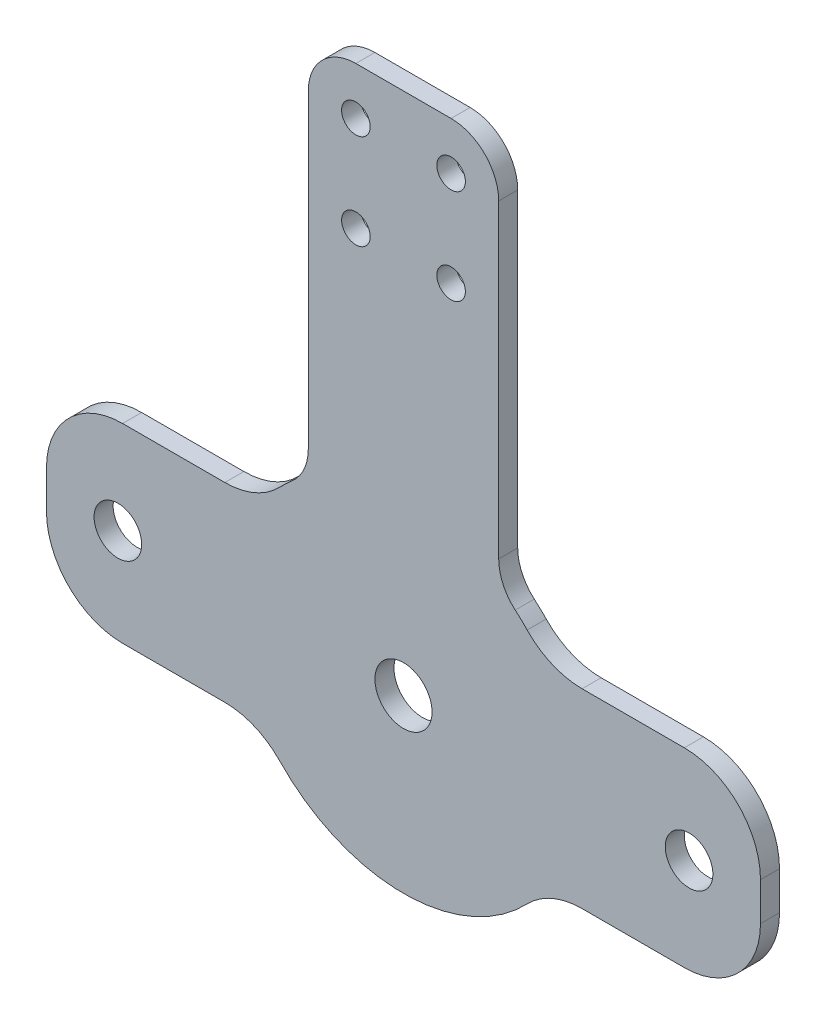
ISO-10303-21;
HEADER;
FILE_DESCRIPTION(('STEP AP214'),'2;1');
FILE_NAME('part.step','',(''),(''),'','','');
FILE_SCHEMA(('AUTOMOTIVE_DESIGN { 1 0 10303 214 1 1 1 1 }'));
ENDSEC;
DATA;
#1=APPLICATION_CONTEXT('core data for automotive mechanical design processes');
#2=APPLICATION_PROTOCOL_DEFINITION('international standard','automotive_design',2000,#1);
#3=PRODUCT_CONTEXT('',#1,'mechanical');
#4=PRODUCT('Part','Part','',(#3));
#5=PRODUCT_RELATED_PRODUCT_CATEGORY('part','',(#4));
#6=PRODUCT_DEFINITION_FORMATION('','',#4);
#7=PRODUCT_DEFINITION_CONTEXT('part definition',#1,'design');
#8=PRODUCT_DEFINITION('design','',#6,#7);
#9=PRODUCT_DEFINITION_SHAPE('','',#8);
#10=(LENGTH_UNIT() NAMED_UNIT(*) SI_UNIT(.MILLI.,.METRE.));
#11=(NAMED_UNIT(*) PLANE_ANGLE_UNIT() SI_UNIT($,.RADIAN.));
#12=(NAMED_UNIT(*) SI_UNIT($,.STERADIAN.) SOLID_ANGLE_UNIT());
#13=UNCERTAINTY_MEASURE_WITH_UNIT(LENGTH_MEASURE(1.E-05),#10,'distance_accuracy_value','');
#14=(GEOMETRIC_REPRESENTATION_CONTEXT(3) GLOBAL_UNCERTAINTY_ASSIGNED_CONTEXT((#13)) GLOBAL_UNIT_ASSIGNED_CONTEXT((#10,
#11,#12)) REPRESENTATION_CONTEXT('',''));
#15=CARTESIAN_POINT('',(0.,0.,0.));
#16=DIRECTION('',(0.,0.,1.));
#17=DIRECTION('',(1.,0.,0.));
#18=AXIS2_PLACEMENT_3D('',#15,#16,#17);
#19=CARTESIAN_POINT('',(0.,0.,2.));
#20=DIRECTION('',(0.,0.,-1.));
#21=DIRECTION('',(-1.,0.,0.));
#22=AXIS2_PLACEMENT_3D('',#19,#20,#21);
#23=CYLINDRICAL_SURFACE('',#22,18.);
#24=CARTESIAN_POINT('',(0.,0.,2.));
#25=DIRECTION('',(0.,0.,1.));
#26=DIRECTION('',(1.,0.,0.));
#27=AXIS2_PLACEMENT_3D('',#24,#25,#26);
#28=CIRCLE('',#27,18.);
#29=CARTESIAN_POINT('',(12.988843642588,12.4615384615385,2.));
#30=VERTEX_POINT('',#29);
#31=CARTESIAN_POINT('',(11.7391304347826,13.645248866736,2.));
#32=VERTEX_POINT('',#31);
#33=EDGE_CURVE('E231',#30,#32,#28,.T.);
#34=ORIENTED_EDGE('',*,*,#33,.F.);
#35=DIRECTION('',(0.,0.,-1.));
#36=VECTOR('',#35,1.);
#37=CARTESIAN_POINT('',(12.988843642588,12.4615384615385,2.));
#38=LINE('',#37,#36);
#39=CARTESIAN_POINT('',(12.988843642588,12.4615384615385,0.));
#40=VERTEX_POINT('',#39);
#41=EDGE_CURVE('E343',#30,#40,#38,.T.);
#42=ORIENTED_EDGE('',*,*,#41,.T.);
#43=CARTESIAN_POINT('',(0.,0.,0.));
#44=DIRECTION('',(0.,0.,1.));
#45=DIRECTION('',(1.,0.,0.));
#46=AXIS2_PLACEMENT_3D('',#43,#44,#45);
#47=CIRCLE('',#46,18.);
#48=CARTESIAN_POINT('',(11.7391304347826,13.645248866736,0.));
#49=VERTEX_POINT('',#48);
#50=EDGE_CURVE('E243',#40,#49,#47,.T.);
#51=ORIENTED_EDGE('',*,*,#50,.T.);
#52=DIRECTION('',(0.,0.,-1.));
#53=VECTOR('',#52,1.);
#54=CARTESIAN_POINT('',(11.7391304347826,13.645248866736,2.));
#55=LINE('',#54,#53);
#56=EDGE_CURVE('E247',#49,#32,#55,.F.);
#57=ORIENTED_EDGE('',*,*,#56,.T.);
#58=EDGE_LOOP('',(#34,#42,#51,#57));
#59=FACE_BOUND('',#58,.T.);
#60=ADVANCED_FACE('F45',(#59),#23,.T.);
#61=CARTESIAN_POINT('',(-12.988843642588,-12.4615384615385,2.));
#62=VERTEX_POINT('',#61);
#63=CARTESIAN_POINT('',(12.988843642588,-12.4615384615385,2.));
#64=VERTEX_POINT('',#63);
#65=EDGE_CURVE('E232',#62,#64,#28,.T.);
#66=ORIENTED_EDGE('',*,*,#65,.F.);
#67=DIRECTION('',(0.,0.,-1.));
#68=VECTOR('',#67,1.);
#69=CARTESIAN_POINT('',(-12.988843642588,-12.4615384615385,2.));
#70=LINE('',#69,#68);
#71=CARTESIAN_POINT('',(-12.988843642588,-12.4615384615385,0.));
#72=VERTEX_POINT('',#71);
#73=EDGE_CURVE('E296',#62,#72,#70,.T.);
#74=ORIENTED_EDGE('',*,*,#73,.T.);
#75=CARTESIAN_POINT('',(12.988843642588,-12.4615384615385,0.));
#76=VERTEX_POINT('',#75);
#77=EDGE_CURVE('E608',#72,#76,#47,.T.);
#78=ORIENTED_EDGE('',*,*,#77,.T.);
#79=DIRECTION('',(0.,0.,-1.));
#80=VECTOR('',#79,1.);
#81=CARTESIAN_POINT('',(12.988843642588,-12.4615384615385,2.));
#82=LINE('',#81,#80);
#83=EDGE_CURVE('E292',#76,#64,#82,.F.);
#84=ORIENTED_EDGE('',*,*,#83,.T.);
#85=EDGE_LOOP('',(#66,#74,#78,#84));
#86=FACE_BOUND('',#85,.T.);
#87=ADVANCED_FACE('F400',(#86),#23,.T.);
#88=CARTESIAN_POINT('',(0.,0.,2.));
#89=DIRECTION('',(0.,0.,1.));
#90=DIRECTION('',(1.,0.,0.));
#91=AXIS2_PLACEMENT_3D('',#88,#89,#90);
#92=PLANE('',#91);
#93=DIRECTION('',(1.,0.,0.));
#94=VECTOR('',#93,1.);
#95=CARTESIAN_POINT('',(14.9666295470958,-10.,2.));
#96=LINE('',#95,#94);
#97=CARTESIAN_POINT('',(18.7616630392937,-10.,2.));
#98=VERTEX_POINT('',#97);
#99=CARTESIAN_POINT('',(29.5,-10.,2.));
#100=VERTEX_POINT('',#99);
#101=EDGE_CURVE('E552',#98,#100,#96,.T.);
#102=ORIENTED_EDGE('',*,*,#101,.T.);
#103=CARTESIAN_POINT('',(29.5,-2.,2.));
#104=DIRECTION('',(0.,0.,1.));
#105=DIRECTION('',(1.,0.,0.));
#106=AXIS2_PLACEMENT_3D('',#103,#104,#105);
#107=CIRCLE('',#106,8.);
#108=CARTESIAN_POINT('',(37.5,-1.99999999999999,2.));
#109=VERTEX_POINT('',#108);
#110=EDGE_CURVE('E315',#100,#109,#107,.T.);
#111=ORIENTED_EDGE('',*,*,#110,.T.);
#112=DIRECTION('',(0.,1.,0.));
#113=VECTOR('',#112,1.);
#114=CARTESIAN_POINT('',(37.5,10.,2.));
#115=LINE('',#114,#113);
#116=CARTESIAN_POINT('',(37.5,2.00000000000001,2.));
#117=VERTEX_POINT('',#116);
#118=EDGE_CURVE('E574',#109,#117,#115,.T.);
#119=ORIENTED_EDGE('',*,*,#118,.T.);
#120=CARTESIAN_POINT('',(29.5,2.,2.));
#121=DIRECTION('',(0.,0.,1.));
#122=DIRECTION('',(1.,0.,0.));
#123=AXIS2_PLACEMENT_3D('',#120,#121,#122);
#124=CIRCLE('',#123,8.);
#125=CARTESIAN_POINT('',(29.5,10.,2.));
#126=VERTEX_POINT('',#125);
#127=EDGE_CURVE('E312',#117,#126,#124,.T.);
#128=ORIENTED_EDGE('',*,*,#127,.T.);
#129=DIRECTION('',(-1.,0.,0.));
#130=VECTOR('',#129,1.);
#131=CARTESIAN_POINT('',(37.5,10.,2.));
#132=LINE('',#131,#130);
#133=CARTESIAN_POINT('',(18.7616630392937,10.,2.));
#134=VERTEX_POINT('',#133);
#135=EDGE_CURVE('E563',#126,#134,#132,.T.);
#136=ORIENTED_EDGE('',*,*,#135,.T.);
#137=CARTESIAN_POINT('',(18.7616630392937,18.,2.));
#138=DIRECTION('',(0.,0.,1.));
#139=DIRECTION('',(1.,0.,0.));
#140=AXIS2_PLACEMENT_3D('',#137,#138,#139);
#141=CIRCLE('',#140,8.);
#142=EDGE_CURVE('E374',#134,#30,#141,.F.);
#143=ORIENTED_EDGE('',*,*,#142,.T.);
#144=ORIENTED_EDGE('',*,*,#33,.T.);
#145=CARTESIAN_POINT('',(15.,17.4355957741627,2.));
#146=DIRECTION('',(0.,0.,1.));
#147=DIRECTION('',(1.,0.,0.));
#148=AXIS2_PLACEMENT_3D('',#145,#146,#147);
#149=CIRCLE('',#148,5.);
#150=CARTESIAN_POINT('',(10.,17.4355957741627,2.));
#151=VERTEX_POINT('',#150);
#152=EDGE_CURVE('E220',#32,#151,#149,.F.);
#153=ORIENTED_EDGE('',*,*,#152,.T.);
#154=DIRECTION('',(0.,1.,0.));
#155=VECTOR('',#154,1.);
#156=CARTESIAN_POINT('',(10.,10.,2.));
#157=LINE('',#156,#155);
#158=CARTESIAN_POINT('',(10.,50.,2.));
#159=VERTEX_POINT('',#158);
#160=EDGE_CURVE('E522',#151,#159,#157,.T.);
#161=ORIENTED_EDGE('',*,*,#160,.T.);
#162=CARTESIAN_POINT('',(5.,50.,2.));
#163=DIRECTION('',(0.,0.,1.));
#164=DIRECTION('',(1.,0.,0.));
#165=AXIS2_PLACEMENT_3D('',#162,#163,#164);
#166=CIRCLE('',#165,5.);
#167=CARTESIAN_POINT('',(5.,55.,2.));
#168=VERTEX_POINT('',#167);
#169=EDGE_CURVE('E261',#159,#168,#166,.T.);
#170=ORIENTED_EDGE('',*,*,#169,.T.);
#171=DIRECTION('',(-1.,0.,0.));
#172=VECTOR('',#171,1.);
#173=CARTESIAN_POINT('',(-10.,55.,2.));
#174=LINE('',#173,#172);
#175=CARTESIAN_POINT('',(-5.,55.,2.));
#176=VERTEX_POINT('',#175);
#177=EDGE_CURVE('E542',#168,#176,#174,.T.);
#178=ORIENTED_EDGE('',*,*,#177,.T.);
#179=CARTESIAN_POINT('',(-5.,50.,2.));
#180=DIRECTION('',(0.,0.,1.));
#181=DIRECTION('',(1.,0.,0.));
#182=AXIS2_PLACEMENT_3D('',#179,#180,#181);
#183=CIRCLE('',#182,5.);
#184=CARTESIAN_POINT('',(-10.,50.,2.));
#185=VERTEX_POINT('',#184);
#186=EDGE_CURVE('E258',#176,#185,#183,.T.);
#187=ORIENTED_EDGE('',*,*,#186,.T.);
#188=DIRECTION('',(0.,-1.,0.));
#189=VECTOR('',#188,1.);
#190=CARTESIAN_POINT('',(-10.,10.,2.));
#191=LINE('',#190,#189);
#192=CARTESIAN_POINT('',(-10.,17.4355957741627,2.));
#193=VERTEX_POINT('',#192);
#194=EDGE_CURVE('E215',#185,#193,#191,.T.);
#195=ORIENTED_EDGE('',*,*,#194,.T.);
#196=CARTESIAN_POINT('',(-15.,17.4355957741627,2.));
#197=DIRECTION('',(0.,0.,1.));
#198=DIRECTION('',(1.,0.,0.));
#199=AXIS2_PLACEMENT_3D('',#196,#197,#198);
#200=CIRCLE('',#199,5.);
#201=CARTESIAN_POINT('',(-11.7391304347826,13.645248866736,2.));
#202=VERTEX_POINT('',#201);
#203=EDGE_CURVE('E208',#193,#202,#200,.F.);
#204=ORIENTED_EDGE('',*,*,#203,.T.);
#205=CARTESIAN_POINT('',(-12.988843642588,12.4615384615385,2.));
#206=VERTEX_POINT('',#205);
#207=EDGE_CURVE('E213',#202,#206,#28,.T.);
#208=ORIENTED_EDGE('',*,*,#207,.T.);
#209=CARTESIAN_POINT('',(-18.7616630392937,18.,2.));
#210=DIRECTION('',(0.,0.,1.));
#211=DIRECTION('',(1.,0.,0.));
#212=AXIS2_PLACEMENT_3D('',#209,#210,#211);
#213=CIRCLE('',#212,8.);
#214=CARTESIAN_POINT('',(-18.7616630392937,10.,2.));
#215=VERTEX_POINT('',#214);
#216=EDGE_CURVE('E54',#206,#215,#213,.F.);
#217=ORIENTED_EDGE('',*,*,#216,.T.);
#218=DIRECTION('',(-1.,0.,0.));
#219=VECTOR('',#218,1.);
#220=CARTESIAN_POINT('',(-37.5,10.,2.));
#221=LINE('',#220,#219);
#222=CARTESIAN_POINT('',(-29.5,10.,2.));
#223=VERTEX_POINT('',#222);
#224=EDGE_CURVE('E382',#215,#223,#221,.T.);
#225=ORIENTED_EDGE('',*,*,#224,.T.);
#226=CARTESIAN_POINT('',(-29.5,2.,2.));
#227=DIRECTION('',(0.,0.,1.));
#228=DIRECTION('',(1.,0.,0.));
#229=AXIS2_PLACEMENT_3D('',#226,#227,#228);
#230=CIRCLE('',#229,8.);
#231=CARTESIAN_POINT('',(-37.5,2.00000000000001,2.));
#232=VERTEX_POINT('',#231);
#233=EDGE_CURVE('E306',#223,#232,#230,.T.);
#234=ORIENTED_EDGE('',*,*,#233,.T.);
#235=DIRECTION('',(0.,-1.,0.));
#236=VECTOR('',#235,1.);
#237=CARTESIAN_POINT('',(-37.5,10.,2.));
#238=LINE('',#237,#236);
#239=CARTESIAN_POINT('',(-37.5,-1.99999999999999,2.));
#240=VERTEX_POINT('',#239);
#241=EDGE_CURVE('E390',#232,#240,#238,.T.);
#242=ORIENTED_EDGE('',*,*,#241,.T.);
#243=CARTESIAN_POINT('',(-29.5,-2.,2.));
#244=DIRECTION('',(0.,0.,1.));
#245=DIRECTION('',(1.,0.,0.));
#246=AXIS2_PLACEMENT_3D('',#243,#244,#245);
#247=CIRCLE('',#246,8.);
#248=CARTESIAN_POINT('',(-29.5,-10.,2.));
#249=VERTEX_POINT('',#248);
#250=EDGE_CURVE('E309',#240,#249,#247,.T.);
#251=ORIENTED_EDGE('',*,*,#250,.T.);
#252=DIRECTION('',(1.,0.,0.));
#253=VECTOR('',#252,1.);
#254=CARTESIAN_POINT('',(-37.5,-10.,2.));
#255=LINE('',#254,#253);
#256=CARTESIAN_POINT('',(-18.7616630392937,-10.,2.));
#257=VERTEX_POINT('',#256);
#258=EDGE_CURVE('E581',#249,#257,#255,.T.);
#259=ORIENTED_EDGE('',*,*,#258,.T.);
#260=CARTESIAN_POINT('',(-18.7616630392937,-18.,2.));
#261=DIRECTION('',(0.,0.,1.));
#262=DIRECTION('',(1.,0.,0.));
#263=AXIS2_PLACEMENT_3D('',#260,#261,#262);
#264=CIRCLE('',#263,8.);
#265=EDGE_CURVE('E362',#257,#62,#264,.F.);
#266=ORIENTED_EDGE('',*,*,#265,.T.);
#267=ORIENTED_EDGE('',*,*,#65,.T.);
#268=CARTESIAN_POINT('',(18.7616630392937,-18.,2.));
#269=DIRECTION('',(0.,0.,1.));
#270=DIRECTION('',(1.,0.,0.));
#271=AXIS2_PLACEMENT_3D('',#268,#269,#270);
#272=CIRCLE('',#271,8.);
#273=EDGE_CURVE('E368',#64,#98,#272,.F.);
#274=ORIENTED_EDGE('',*,*,#273,.T.);
#275=EDGE_LOOP('',(#102,#111,#119,#128,#136,#143,#144,#153,#161,#170,#178,#187,#195,#204,#208,
#217,#225,#234,#242,#251,#259,#266,#267,#274));
#276=FACE_BOUND('',#275,.T.);
#277=CARTESIAN_POINT('',(0.,0.,2.));
#278=DIRECTION('',(0.,0.,1.));
#279=DIRECTION('',(1.,0.,0.));
#280=AXIS2_PLACEMENT_3D('',#277,#278,#279);
#281=CIRCLE('',#280,3.);
#282=CARTESIAN_POINT('',(3.,0.,2.));
#283=VERTEX_POINT('',#282);
#284=EDGE_CURVE('E604',#283,#283,#281,.T.);
#285=ORIENTED_EDGE('',*,*,#284,.F.);
#286=EDGE_LOOP('',(#285));
#287=FACE_BOUND('',#286,.T.);
#288=CARTESIAN_POINT('',(-30.,0.,2.));
#289=DIRECTION('',(0.,0.,1.));
#290=DIRECTION('',(1.,0.,0.));
#291=AXIS2_PLACEMENT_3D('',#288,#289,#290);
#292=CIRCLE('',#291,2.5);
#293=CARTESIAN_POINT('',(-27.5,0.,2.));
#294=VERTEX_POINT('',#293);
#295=EDGE_CURVE('E557',#294,#294,#292,.T.);
#296=ORIENTED_EDGE('',*,*,#295,.F.);
#297=EDGE_LOOP('',(#296));
#298=FACE_BOUND('',#297,.T.);
#299=CARTESIAN_POINT('',(30.,0.,2.));
#300=DIRECTION('',(0.,0.,1.));
#301=DIRECTION('',(1.,0.,0.));
#302=AXIS2_PLACEMENT_3D('',#299,#300,#301);
#303=CIRCLE('',#302,2.5);
#304=CARTESIAN_POINT('',(32.5,0.,2.));
#305=VERTEX_POINT('',#304);
#306=EDGE_CURVE('E553',#305,#305,#303,.T.);
#307=ORIENTED_EDGE('',*,*,#306,.F.);
#308=EDGE_LOOP('',(#307));
#309=FACE_BOUND('',#308,.T.);
#310=CARTESIAN_POINT('',(5.,50.,2.));
#311=DIRECTION('',(0.,0.,1.));
#312=DIRECTION('',(1.,0.,0.));
#313=AXIS2_PLACEMENT_3D('',#310,#311,#312);
#314=CIRCLE('',#313,1.5);
#315=CARTESIAN_POINT('',(6.5,50.,2.));
#316=VERTEX_POINT('',#315);
#317=EDGE_CURVE('E494',#316,#316,#314,.T.);
#318=ORIENTED_EDGE('',*,*,#317,.F.);
#319=EDGE_LOOP('',(#318));
#320=FACE_BOUND('',#319,.T.);
#321=CARTESIAN_POINT('',(5.,40.,2.));
#322=DIRECTION('',(0.,0.,1.));
#323=DIRECTION('',(1.,0.,0.));
#324=AXIS2_PLACEMENT_3D('',#321,#322,#323);
#325=CIRCLE('',#324,1.5);
#326=CARTESIAN_POINT('',(6.5,40.,2.));
#327=VERTEX_POINT('',#326);
#328=EDGE_CURVE('E499',#327,#327,#325,.T.);
#329=ORIENTED_EDGE('',*,*,#328,.F.);
#330=EDGE_LOOP('',(#329));
#331=FACE_BOUND('',#330,.T.);
#332=CARTESIAN_POINT('',(-5.,40.,2.));
#333=DIRECTION('',(0.,0.,1.));
#334=DIRECTION('',(1.,0.,0.));
#335=AXIS2_PLACEMENT_3D('',#332,#333,#334);
#336=CIRCLE('',#335,1.5);
#337=CARTESIAN_POINT('',(-3.5,40.,2.));
#338=VERTEX_POINT('',#337);
#339=EDGE_CURVE('E506',#338,#338,#336,.T.);
#340=ORIENTED_EDGE('',*,*,#339,.F.);
#341=EDGE_LOOP('',(#340));
#342=FACE_BOUND('',#341,.T.);
#343=CARTESIAN_POINT('',(-5.,50.,2.));
#344=DIRECTION('',(0.,0.,1.));
#345=DIRECTION('',(1.,0.,0.));
#346=AXIS2_PLACEMENT_3D('',#343,#344,#345);
#347=CIRCLE('',#346,1.5);
#348=CARTESIAN_POINT('',(-3.5,50.,2.));
#349=VERTEX_POINT('',#348);
#350=EDGE_CURVE('E514',#349,#349,#347,.T.);
#351=ORIENTED_EDGE('',*,*,#350,.F.);
#352=EDGE_LOOP('',(#351));
#353=FACE_BOUND('',#352,.T.);
#354=ADVANCED_FACE('F211',(#276,#287,#298,#309,#320,#331,#342,#353),#92,.T.);
#355=CARTESIAN_POINT('',(0.,0.,0.));
#356=DIRECTION('',(0.,0.,1.));
#357=DIRECTION('',(1.,0.,0.));
#358=AXIS2_PLACEMENT_3D('',#355,#356,#357);
#359=PLANE('',#358);
#360=DIRECTION('',(0.,1.,0.));
#361=VECTOR('',#360,1.);
#362=CARTESIAN_POINT('',(37.5,10.,0.));
#363=LINE('',#362,#361);
#364=CARTESIAN_POINT('',(37.5,-1.99999999999999,0.));
#365=VERTEX_POINT('',#364);
#366=CARTESIAN_POINT('',(37.5,2.00000000000001,0.));
#367=VERTEX_POINT('',#366);
#368=EDGE_CURVE('E562',#365,#367,#363,.T.);
#369=ORIENTED_EDGE('',*,*,#368,.F.);
#370=CARTESIAN_POINT('',(29.5,-2.,0.));
#371=DIRECTION('',(0.,0.,1.));
#372=DIRECTION('',(1.,0.,0.));
#373=AXIS2_PLACEMENT_3D('',#370,#371,#372);
#374=CIRCLE('',#373,8.);
#375=CARTESIAN_POINT('',(29.5,-10.,0.));
#376=VERTEX_POINT('',#375);
#377=EDGE_CURVE('E333',#365,#376,#374,.F.);
#378=ORIENTED_EDGE('',*,*,#377,.T.);
#379=DIRECTION('',(1.,0.,0.));
#380=VECTOR('',#379,1.);
#381=CARTESIAN_POINT('',(14.9666295470958,-10.,0.));
#382=LINE('',#381,#380);
#383=CARTESIAN_POINT('',(18.7616630392937,-10.,0.));
#384=VERTEX_POINT('',#383);
#385=EDGE_CURVE('E558',#384,#376,#382,.T.);
#386=ORIENTED_EDGE('',*,*,#385,.F.);
#387=CARTESIAN_POINT('',(18.7616630392937,-18.,0.));
#388=DIRECTION('',(0.,0.,1.));
#389=DIRECTION('',(1.,0.,0.));
#390=AXIS2_PLACEMENT_3D('',#387,#388,#389);
#391=CIRCLE('',#390,8.);
#392=EDGE_CURVE('E371',#384,#76,#391,.T.);
#393=ORIENTED_EDGE('',*,*,#392,.T.);
#394=ORIENTED_EDGE('',*,*,#77,.F.);
#395=CARTESIAN_POINT('',(-18.7616630392937,-18.,0.));
#396=DIRECTION('',(0.,0.,1.));
#397=DIRECTION('',(1.,0.,0.));
#398=AXIS2_PLACEMENT_3D('',#395,#396,#397);
#399=CIRCLE('',#398,8.);
#400=CARTESIAN_POINT('',(-18.7616630392937,-10.,0.));
#401=VERTEX_POINT('',#400);
#402=EDGE_CURVE('E365',#72,#401,#399,.T.);
#403=ORIENTED_EDGE('',*,*,#402,.T.);
#404=DIRECTION('',(1.,0.,0.));
#405=VECTOR('',#404,1.);
#406=CARTESIAN_POINT('',(-37.5,-10.,0.));
#407=LINE('',#406,#405);
#408=CARTESIAN_POINT('',(-29.5,-10.,0.));
#409=VERTEX_POINT('',#408);
#410=EDGE_CURVE('E538',#409,#401,#407,.T.);
#411=ORIENTED_EDGE('',*,*,#410,.F.);
#412=CARTESIAN_POINT('',(-29.5,-2.,0.));
#413=DIRECTION('',(0.,0.,1.));
#414=DIRECTION('',(1.,0.,0.));
#415=AXIS2_PLACEMENT_3D('',#412,#413,#414);
#416=CIRCLE('',#415,8.);
#417=CARTESIAN_POINT('',(-37.5,-1.99999999999999,0.));
#418=VERTEX_POINT('',#417);
#419=EDGE_CURVE('E327',#409,#418,#416,.F.);
#420=ORIENTED_EDGE('',*,*,#419,.T.);
#421=DIRECTION('',(0.,-1.,0.));
#422=VECTOR('',#421,1.);
#423=CARTESIAN_POINT('',(-37.5,10.,0.));
#424=LINE('',#423,#422);
#425=CARTESIAN_POINT('',(-37.5,2.00000000000001,0.));
#426=VERTEX_POINT('',#425);
#427=EDGE_CURVE('E592',#426,#418,#424,.T.);
#428=ORIENTED_EDGE('',*,*,#427,.F.);
#429=CARTESIAN_POINT('',(-29.5,2.,0.));
#430=DIRECTION('',(0.,0.,1.));
#431=DIRECTION('',(1.,0.,0.));
#432=AXIS2_PLACEMENT_3D('',#429,#430,#431);
#433=CIRCLE('',#432,8.);
#434=CARTESIAN_POINT('',(-29.5,10.,0.));
#435=VERTEX_POINT('',#434);
#436=EDGE_CURVE('E65',#426,#435,#433,.F.);
#437=ORIENTED_EDGE('',*,*,#436,.T.);
#438=DIRECTION('',(-1.,0.,0.));
#439=VECTOR('',#438,1.);
#440=CARTESIAN_POINT('',(-37.5,10.,0.));
#441=LINE('',#440,#439);
#442=CARTESIAN_POINT('',(-18.7616630392937,10.,0.));
#443=VERTEX_POINT('',#442);
#444=EDGE_CURVE('E585',#443,#435,#441,.T.);
#445=ORIENTED_EDGE('',*,*,#444,.F.);
#446=CARTESIAN_POINT('',(-18.7616630392937,18.,0.));
#447=DIRECTION('',(0.,0.,1.));
#448=DIRECTION('',(1.,0.,0.));
#449=AXIS2_PLACEMENT_3D('',#446,#447,#448);
#450=CIRCLE('',#449,8.);
#451=CARTESIAN_POINT('',(-12.988843642588,12.4615384615385,0.));
#452=VERTEX_POINT('',#451);
#453=EDGE_CURVE('E11',#443,#452,#450,.T.);
#454=ORIENTED_EDGE('',*,*,#453,.T.);
#455=CARTESIAN_POINT('',(-11.7391304347826,13.645248866736,0.));
#456=VERTEX_POINT('',#455);
#457=EDGE_CURVE('E642',#456,#452,#47,.T.);
#458=ORIENTED_EDGE('',*,*,#457,.F.);
#459=CARTESIAN_POINT('',(-15.,17.4355957741627,0.));
#460=DIRECTION('',(0.,0.,1.));
#461=DIRECTION('',(1.,0.,0.));
#462=AXIS2_PLACEMENT_3D('',#459,#460,#461);
#463=CIRCLE('',#462,5.);
#464=CARTESIAN_POINT('',(-10.,17.4355957741627,0.));
#465=VERTEX_POINT('',#464);
#466=EDGE_CURVE('E221',#456,#465,#463,.T.);
#467=ORIENTED_EDGE('',*,*,#466,.T.);
#468=DIRECTION('',(0.,-1.,0.));
#469=VECTOR('',#468,1.);
#470=CARTESIAN_POINT('',(-10.,10.,0.));
#471=LINE('',#470,#469);
#472=CARTESIAN_POINT('',(-10.,50.,0.));
#473=VERTEX_POINT('',#472);
#474=EDGE_CURVE('E534',#473,#465,#471,.T.);
#475=ORIENTED_EDGE('',*,*,#474,.F.);
#476=CARTESIAN_POINT('',(-5.,50.,0.));
#477=DIRECTION('',(0.,0.,1.));
#478=DIRECTION('',(1.,0.,0.));
#479=AXIS2_PLACEMENT_3D('',#476,#477,#478);
#480=CIRCLE('',#479,5.);
#481=CARTESIAN_POINT('',(-5.,55.,0.));
#482=VERTEX_POINT('',#481);
#483=EDGE_CURVE('E271',#473,#482,#480,.F.);
#484=ORIENTED_EDGE('',*,*,#483,.T.);
#485=DIRECTION('',(-1.,0.,0.));
#486=VECTOR('',#485,1.);
#487=CARTESIAN_POINT('',(-10.,55.,0.));
#488=LINE('',#487,#486);
#489=CARTESIAN_POINT('',(5.,55.,0.));
#490=VERTEX_POINT('',#489);
#491=EDGE_CURVE('E530',#490,#482,#488,.T.);
#492=ORIENTED_EDGE('',*,*,#491,.F.);
#493=CARTESIAN_POINT('',(5.,50.,0.));
#494=DIRECTION('',(0.,0.,1.));
#495=DIRECTION('',(1.,0.,0.));
#496=AXIS2_PLACEMENT_3D('',#493,#494,#495);
#497=CIRCLE('',#496,5.);
#498=CARTESIAN_POINT('',(10.,50.,0.));
#499=VERTEX_POINT('',#498);
#500=EDGE_CURVE('E274',#490,#499,#497,.F.);
#501=ORIENTED_EDGE('',*,*,#500,.T.);
#502=DIRECTION('',(0.,1.,0.));
#503=VECTOR('',#502,1.);
#504=CARTESIAN_POINT('',(10.,10.,0.));
#505=LINE('',#504,#503);
#506=CARTESIAN_POINT('',(10.,17.4355957741627,0.));
#507=VERTEX_POINT('',#506);
#508=EDGE_CURVE('E526',#507,#499,#505,.T.);
#509=ORIENTED_EDGE('',*,*,#508,.F.);
#510=CARTESIAN_POINT('',(15.,17.4355957741627,0.));
#511=DIRECTION('',(0.,0.,1.));
#512=DIRECTION('',(1.,0.,0.));
#513=AXIS2_PLACEMENT_3D('',#510,#511,#512);
#514=CIRCLE('',#513,5.);
#515=EDGE_CURVE('E281',#507,#49,#514,.T.);
#516=ORIENTED_EDGE('',*,*,#515,.T.);
#517=ORIENTED_EDGE('',*,*,#50,.F.);
#518=CARTESIAN_POINT('',(18.7616630392937,18.,0.));
#519=DIRECTION('',(0.,0.,1.));
#520=DIRECTION('',(1.,0.,0.));
#521=AXIS2_PLACEMENT_3D('',#518,#519,#520);
#522=CIRCLE('',#521,8.);
#523=CARTESIAN_POINT('',(18.7616630392937,10.,0.));
#524=VERTEX_POINT('',#523);
#525=EDGE_CURVE('E377',#40,#524,#522,.T.);
#526=ORIENTED_EDGE('',*,*,#525,.T.);
#527=DIRECTION('',(-1.,0.,0.));
#528=VECTOR('',#527,1.);
#529=CARTESIAN_POINT('',(37.5,10.,0.));
#530=LINE('',#529,#528);
#531=CARTESIAN_POINT('',(29.5,10.,0.));
#532=VERTEX_POINT('',#531);
#533=EDGE_CURVE('E567',#532,#524,#530,.T.);
#534=ORIENTED_EDGE('',*,*,#533,.F.);
#535=CARTESIAN_POINT('',(29.5,2.,0.));
#536=DIRECTION('',(0.,0.,1.));
#537=DIRECTION('',(1.,0.,0.));
#538=AXIS2_PLACEMENT_3D('',#535,#536,#537);
#539=CIRCLE('',#538,8.);
#540=EDGE_CURVE('E330',#532,#367,#539,.F.);
#541=ORIENTED_EDGE('',*,*,#540,.T.);
#542=EDGE_LOOP('',(#369,#378,#386,#393,#394,#403,#411,#420,#428,#437,#445,#454,#458,#467,#475,
#484,#492,#501,#509,#516,#517,#526,#534,#541));
#543=FACE_BOUND('',#542,.T.);
#544=CARTESIAN_POINT('',(0.,0.,0.));
#545=DIRECTION('',(0.,0.,1.));
#546=DIRECTION('',(1.,0.,0.));
#547=AXIS2_PLACEMENT_3D('',#544,#545,#546);
#548=CIRCLE('',#547,3.);
#549=CARTESIAN_POINT('',(3.,0.,0.));
#550=VERTEX_POINT('',#549);
#551=EDGE_CURVE('E571',#550,#550,#548,.T.);
#552=ORIENTED_EDGE('',*,*,#551,.T.);
#553=EDGE_LOOP('',(#552));
#554=FACE_BOUND('',#553,.T.);
#555=CARTESIAN_POINT('',(-30.,0.,0.));
#556=DIRECTION('',(0.,0.,1.));
#557=DIRECTION('',(1.,0.,0.));
#558=AXIS2_PLACEMENT_3D('',#555,#556,#557);
#559=CIRCLE('',#558,2.5);
#560=CARTESIAN_POINT('',(-27.5,0.,0.));
#561=VERTEX_POINT('',#560);
#562=EDGE_CURVE('E389',#561,#561,#559,.T.);
#563=ORIENTED_EDGE('',*,*,#562,.T.);
#564=EDGE_LOOP('',(#563));
#565=FACE_BOUND('',#564,.T.);
#566=CARTESIAN_POINT('',(30.,0.,0.));
#567=DIRECTION('',(0.,0.,1.));
#568=DIRECTION('',(1.,0.,0.));
#569=AXIS2_PLACEMENT_3D('',#566,#567,#568);
#570=CIRCLE('',#569,2.5);
#571=CARTESIAN_POINT('',(32.5,0.,0.));
#572=VERTEX_POINT('',#571);
#573=EDGE_CURVE('E548',#572,#572,#570,.T.);
#574=ORIENTED_EDGE('',*,*,#573,.T.);
#575=EDGE_LOOP('',(#574));
#576=FACE_BOUND('',#575,.T.);
#577=CARTESIAN_POINT('',(5.,50.,0.));
#578=DIRECTION('',(0.,0.,1.));
#579=DIRECTION('',(1.,0.,0.));
#580=AXIS2_PLACEMENT_3D('',#577,#578,#579);
#581=CIRCLE('',#580,1.5);
#582=CARTESIAN_POINT('',(6.5,50.,0.));
#583=VERTEX_POINT('',#582);
#584=EDGE_CURVE('E491',#583,#583,#581,.T.);
#585=ORIENTED_EDGE('',*,*,#584,.T.);
#586=EDGE_LOOP('',(#585));
#587=FACE_BOUND('',#586,.T.);
#588=CARTESIAN_POINT('',(5.,40.,0.));
#589=DIRECTION('',(0.,0.,1.));
#590=DIRECTION('',(1.,0.,0.));
#591=AXIS2_PLACEMENT_3D('',#588,#589,#590);
#592=CIRCLE('',#591,1.5);
#593=CARTESIAN_POINT('',(6.5,40.,0.));
#594=VERTEX_POINT('',#593);
#595=EDGE_CURVE('E502',#594,#594,#592,.T.);
#596=ORIENTED_EDGE('',*,*,#595,.T.);
#597=EDGE_LOOP('',(#596));
#598=FACE_BOUND('',#597,.T.);
#599=CARTESIAN_POINT('',(-5.,40.,0.));
#600=DIRECTION('',(0.,0.,1.));
#601=DIRECTION('',(1.,0.,0.));
#602=AXIS2_PLACEMENT_3D('',#599,#600,#601);
#603=CIRCLE('',#602,1.5);
#604=CARTESIAN_POINT('',(-3.5,40.,0.));
#605=VERTEX_POINT('',#604);
#606=EDGE_CURVE('E510',#605,#605,#603,.T.);
#607=ORIENTED_EDGE('',*,*,#606,.T.);
#608=EDGE_LOOP('',(#607));
#609=FACE_BOUND('',#608,.T.);
#610=CARTESIAN_POINT('',(-5.,50.,0.));
#611=DIRECTION('',(0.,0.,1.));
#612=DIRECTION('',(1.,0.,0.));
#613=AXIS2_PLACEMENT_3D('',#610,#611,#612);
#614=CIRCLE('',#613,1.5);
#615=CARTESIAN_POINT('',(-3.5,50.,0.));
#616=VERTEX_POINT('',#615);
#617=EDGE_CURVE('E518',#616,#616,#614,.T.);
#618=ORIENTED_EDGE('',*,*,#617,.T.);
#619=EDGE_LOOP('',(#618));
#620=FACE_BOUND('',#619,.T.);
#621=ADVANCED_FACE('F413',(#543,#554,#565,#576,#587,#598,#609,#620),#359,.F.);
#622=ORIENTED_EDGE('',*,*,#457,.T.);
#623=DIRECTION('',(0.,0.,-1.));
#624=VECTOR('',#623,1.);
#625=CARTESIAN_POINT('',(-12.988843642588,12.4615384615385,2.));
#626=LINE('',#625,#624);
#627=EDGE_CURVE('E229',#452,#206,#626,.F.);
#628=ORIENTED_EDGE('',*,*,#627,.T.);
#629=ORIENTED_EDGE('',*,*,#207,.F.);
#630=DIRECTION('',(0.,0.,-1.));
#631=VECTOR('',#630,1.);
#632=CARTESIAN_POINT('',(-11.7391304347826,13.645248866736,2.));
#633=LINE('',#632,#631);
#634=EDGE_CURVE('E227',#202,#456,#633,.T.);
#635=ORIENTED_EDGE('',*,*,#634,.T.);
#636=EDGE_LOOP('',(#622,#628,#629,#635));
#637=FACE_BOUND('',#636,.T.);
#638=ADVANCED_FACE('F226',(#637),#23,.T.);
#639=CARTESIAN_POINT('',(0.,0.,2.));
#640=DIRECTION('',(0.,0.,-1.));
#641=DIRECTION('',(-1.,0.,0.));
#642=AXIS2_PLACEMENT_3D('',#639,#640,#641);
#643=CYLINDRICAL_SURFACE('',#642,3.);
#644=ORIENTED_EDGE('',*,*,#284,.T.);
#645=EDGE_LOOP('',(#644));
#646=FACE_BOUND('',#645,.T.);
#647=ORIENTED_EDGE('',*,*,#551,.F.);
#648=EDGE_LOOP('',(#647));
#649=FACE_BOUND('',#648,.T.);
#650=ADVANCED_FACE('F412',(#646,#649),#643,.F.);
#651=CARTESIAN_POINT('',(-37.5,10.,0.));
#652=DIRECTION('',(0.,1.,0.));
#653=DIRECTION('',(0.,0.,1.));
#654=AXIS2_PLACEMENT_3D('',#651,#652,#653);
#655=PLANE('',#654);
#656=ORIENTED_EDGE('',*,*,#444,.T.);
#657=DIRECTION('',(0.,0.,1.));
#658=VECTOR('',#657,1.);
#659=CARTESIAN_POINT('',(-29.5,10.,0.));
#660=LINE('',#659,#658);
#661=EDGE_CURVE('E356',#435,#223,#660,.T.);
#662=ORIENTED_EDGE('',*,*,#661,.T.);
#663=ORIENTED_EDGE('',*,*,#224,.F.);
#664=DIRECTION('',(0.,0.,-1.));
#665=VECTOR('',#664,1.);
#666=CARTESIAN_POINT('',(-18.7616630392937,10.,0.));
#667=LINE('',#666,#665);
#668=EDGE_CURVE('E353',#215,#443,#667,.T.);
#669=ORIENTED_EDGE('',*,*,#668,.T.);
#670=EDGE_LOOP('',(#656,#662,#663,#669));
#671=FACE_BOUND('',#670,.T.);
#672=ADVANCED_FACE('F386',(#671),#655,.T.);
#673=CARTESIAN_POINT('',(-37.5,-10.,0.));
#674=DIRECTION('',(0.,-1.,0.));
#675=DIRECTION('',(0.,0.,-1.));
#676=AXIS2_PLACEMENT_3D('',#673,#674,#675);
#677=PLANE('',#676);
#678=ORIENTED_EDGE('',*,*,#410,.T.);
#679=DIRECTION('',(0.,0.,-1.));
#680=VECTOR('',#679,1.);
#681=CARTESIAN_POINT('',(-18.7616630392937,-10.,0.));
#682=LINE('',#681,#680);
#683=EDGE_CURVE('E288',#401,#257,#682,.F.);
#684=ORIENTED_EDGE('',*,*,#683,.T.);
#685=ORIENTED_EDGE('',*,*,#258,.F.);
#686=DIRECTION('',(0.,0.,1.));
#687=VECTOR('',#686,1.);
#688=CARTESIAN_POINT('',(-29.5,-10.,0.));
#689=LINE('',#688,#687);
#690=EDGE_CURVE('E285',#249,#409,#689,.F.);
#691=ORIENTED_EDGE('',*,*,#690,.T.);
#692=EDGE_LOOP('',(#678,#684,#685,#691));
#693=FACE_BOUND('',#692,.T.);
#694=ADVANCED_FACE('F434',(#693),#677,.T.);
#695=CARTESIAN_POINT('',(-37.5,10.,0.));
#696=DIRECTION('',(-1.,0.,0.));
#697=DIRECTION('',(0.,-1.,0.));
#698=AXIS2_PLACEMENT_3D('',#695,#696,#697);
#699=PLANE('',#698);
#700=ORIENTED_EDGE('',*,*,#427,.T.);
#701=DIRECTION('',(0.,0.,1.));
#702=VECTOR('',#701,1.);
#703=CARTESIAN_POINT('',(-37.5,-1.99999999999999,0.));
#704=LINE('',#703,#702);
#705=EDGE_CURVE('E349',#418,#240,#704,.T.);
#706=ORIENTED_EDGE('',*,*,#705,.T.);
#707=ORIENTED_EDGE('',*,*,#241,.F.);
#708=DIRECTION('',(0.,0.,1.));
#709=VECTOR('',#708,1.);
#710=CARTESIAN_POINT('',(-37.5,2.00000000000001,0.));
#711=LINE('',#710,#709);
#712=EDGE_CURVE('E346',#232,#426,#711,.F.);
#713=ORIENTED_EDGE('',*,*,#712,.T.);
#714=EDGE_LOOP('',(#700,#706,#707,#713));
#715=FACE_BOUND('',#714,.T.);
#716=ADVANCED_FACE('F432',(#715),#699,.T.);
#717=CARTESIAN_POINT('',(-30.,0.,0.));
#718=DIRECTION('',(0.,0.,1.));
#719=DIRECTION('',(1.,0.,0.));
#720=AXIS2_PLACEMENT_3D('',#717,#718,#719);
#721=CYLINDRICAL_SURFACE('',#720,2.5);
#722=ORIENTED_EDGE('',*,*,#562,.F.);
#723=EDGE_LOOP('',(#722));
#724=FACE_BOUND('',#723,.T.);
#725=ORIENTED_EDGE('',*,*,#295,.T.);
#726=EDGE_LOOP('',(#725));
#727=FACE_BOUND('',#726,.T.);
#728=ADVANCED_FACE('F428',(#724,#727),#721,.F.);
#729=CARTESIAN_POINT('',(14.9666295470958,-10.,0.));
#730=DIRECTION('',(0.,-1.,0.));
#731=DIRECTION('',(0.,0.,-1.));
#732=AXIS2_PLACEMENT_3D('',#729,#730,#731);
#733=PLANE('',#732);
#734=ORIENTED_EDGE('',*,*,#101,.F.);
#735=DIRECTION('',(0.,0.,-1.));
#736=VECTOR('',#735,1.);
#737=CARTESIAN_POINT('',(18.7616630392937,-10.,0.));
#738=LINE('',#737,#736);
#739=EDGE_CURVE('E303',#98,#384,#738,.T.);
#740=ORIENTED_EDGE('',*,*,#739,.T.);
#741=ORIENTED_EDGE('',*,*,#385,.T.);
#742=DIRECTION('',(0.,0.,1.));
#743=VECTOR('',#742,1.);
#744=CARTESIAN_POINT('',(29.5,-10.,0.));
#745=LINE('',#744,#743);
#746=EDGE_CURVE('E299',#376,#100,#745,.T.);
#747=ORIENTED_EDGE('',*,*,#746,.T.);
#748=EDGE_LOOP('',(#734,#740,#741,#747));
#749=FACE_BOUND('',#748,.T.);
#750=ADVANCED_FACE('F431',(#749),#733,.T.);
#751=CARTESIAN_POINT('',(37.5,10.,0.));
#752=DIRECTION('',(0.,1.,0.));
#753=DIRECTION('',(0.,0.,1.));
#754=AXIS2_PLACEMENT_3D('',#751,#752,#753);
#755=PLANE('',#754);
#756=ORIENTED_EDGE('',*,*,#135,.F.);
#757=DIRECTION('',(0.,0.,1.));
#758=VECTOR('',#757,1.);
#759=CARTESIAN_POINT('',(29.5,10.,0.));
#760=LINE('',#759,#758);
#761=EDGE_CURVE('E340',#126,#532,#760,.F.);
#762=ORIENTED_EDGE('',*,*,#761,.T.);
#763=ORIENTED_EDGE('',*,*,#533,.T.);
#764=DIRECTION('',(0.,0.,-1.));
#765=VECTOR('',#764,1.);
#766=CARTESIAN_POINT('',(18.7616630392937,10.,0.));
#767=LINE('',#766,#765);
#768=EDGE_CURVE('E336',#524,#134,#767,.F.);
#769=ORIENTED_EDGE('',*,*,#768,.T.);
#770=EDGE_LOOP('',(#756,#762,#763,#769));
#771=FACE_BOUND('',#770,.T.);
#772=ADVANCED_FACE('F444',(#771),#755,.T.);
#773=CARTESIAN_POINT('',(37.5,10.,0.));
#774=DIRECTION('',(1.,0.,0.));
#775=DIRECTION('',(0.,1.,0.));
#776=AXIS2_PLACEMENT_3D('',#773,#774,#775);
#777=PLANE('',#776);
#778=ORIENTED_EDGE('',*,*,#118,.F.);
#779=DIRECTION('',(0.,0.,1.));
#780=VECTOR('',#779,1.);
#781=CARTESIAN_POINT('',(37.5,-1.99999999999999,0.));
#782=LINE('',#781,#780);
#783=EDGE_CURVE('E322',#109,#365,#782,.F.);
#784=ORIENTED_EDGE('',*,*,#783,.T.);
#785=ORIENTED_EDGE('',*,*,#368,.T.);
#786=DIRECTION('',(0.,0.,1.));
#787=VECTOR('',#786,1.);
#788=CARTESIAN_POINT('',(37.5,2.00000000000001,0.));
#789=LINE('',#788,#787);
#790=EDGE_CURVE('E318',#367,#117,#789,.T.);
#791=ORIENTED_EDGE('',*,*,#790,.T.);
#792=EDGE_LOOP('',(#778,#784,#785,#791));
#793=FACE_BOUND('',#792,.T.);
#794=ADVANCED_FACE('F446',(#793),#777,.T.);
#795=CARTESIAN_POINT('',(30.,0.,0.));
#796=DIRECTION('',(0.,0.,1.));
#797=DIRECTION('',(1.,0.,0.));
#798=AXIS2_PLACEMENT_3D('',#795,#796,#797);
#799=CYLINDRICAL_SURFACE('',#798,2.5);
#800=ORIENTED_EDGE('',*,*,#573,.F.);
#801=EDGE_LOOP('',(#800));
#802=FACE_BOUND('',#801,.T.);
#803=ORIENTED_EDGE('',*,*,#306,.T.);
#804=EDGE_LOOP('',(#803));
#805=FACE_BOUND('',#804,.T.);
#806=ADVANCED_FACE('F449',(#802,#805),#799,.F.);
#807=CARTESIAN_POINT('',(10.,10.,0.));
#808=DIRECTION('',(1.,0.,0.));
#809=DIRECTION('',(0.,0.,-1.));
#810=AXIS2_PLACEMENT_3D('',#807,#808,#809);
#811=PLANE('',#810);
#812=ORIENTED_EDGE('',*,*,#160,.F.);
#813=DIRECTION('',(0.,0.,-1.));
#814=VECTOR('',#813,1.);
#815=CARTESIAN_POINT('',(10.,17.4355957741627,0.));
#816=LINE('',#815,#814);
#817=EDGE_CURVE('E255',#151,#507,#816,.T.);
#818=ORIENTED_EDGE('',*,*,#817,.T.);
#819=ORIENTED_EDGE('',*,*,#508,.T.);
#820=DIRECTION('',(0.,0.,1.));
#821=VECTOR('',#820,1.);
#822=CARTESIAN_POINT('',(10.,50.,0.));
#823=LINE('',#822,#821);
#824=EDGE_CURVE('E251',#499,#159,#823,.T.);
#825=ORIENTED_EDGE('',*,*,#824,.T.);
#826=EDGE_LOOP('',(#812,#818,#819,#825));
#827=FACE_BOUND('',#826,.T.);
#828=ADVANCED_FACE('F456',(#827),#811,.T.);
#829=CARTESIAN_POINT('',(-10.,10.,0.));
#830=DIRECTION('',(-1.,0.,0.));
#831=DIRECTION('',(0.,0.,1.));
#832=AXIS2_PLACEMENT_3D('',#829,#830,#831);
#833=PLANE('',#832);
#834=ORIENTED_EDGE('',*,*,#474,.T.);
#835=DIRECTION('',(0.,0.,-1.));
#836=VECTOR('',#835,1.);
#837=CARTESIAN_POINT('',(-10.,17.4355957741627,0.));
#838=LINE('',#837,#836);
#839=EDGE_CURVE('E240',#465,#193,#838,.F.);
#840=ORIENTED_EDGE('',*,*,#839,.T.);
#841=ORIENTED_EDGE('',*,*,#194,.F.);
#842=DIRECTION('',(0.,0.,1.));
#843=VECTOR('',#842,1.);
#844=CARTESIAN_POINT('',(-10.,50.,0.));
#845=LINE('',#844,#843);
#846=EDGE_CURVE('E236',#185,#473,#845,.F.);
#847=ORIENTED_EDGE('',*,*,#846,.T.);
#848=EDGE_LOOP('',(#834,#840,#841,#847));
#849=FACE_BOUND('',#848,.T.);
#850=ADVANCED_FACE('F460',(#849),#833,.T.);
#851=CARTESIAN_POINT('',(-10.,55.,0.));
#852=DIRECTION('',(0.,1.,0.));
#853=DIRECTION('',(0.,0.,1.));
#854=AXIS2_PLACEMENT_3D('',#851,#852,#853);
#855=PLANE('',#854);
#856=ORIENTED_EDGE('',*,*,#177,.F.);
#857=DIRECTION('',(0.,0.,1.));
#858=VECTOR('',#857,1.);
#859=CARTESIAN_POINT('',(5.,55.,0.));
#860=LINE('',#859,#858);
#861=EDGE_CURVE('E268',#168,#490,#860,.F.);
#862=ORIENTED_EDGE('',*,*,#861,.T.);
#863=ORIENTED_EDGE('',*,*,#491,.T.);
#864=DIRECTION('',(0.,0.,1.));
#865=VECTOR('',#864,1.);
#866=CARTESIAN_POINT('',(-5.,55.,0.));
#867=LINE('',#866,#865);
#868=EDGE_CURVE('E264',#482,#176,#867,.T.);
#869=ORIENTED_EDGE('',*,*,#868,.T.);
#870=EDGE_LOOP('',(#856,#862,#863,#869));
#871=FACE_BOUND('',#870,.T.);
#872=ADVANCED_FACE('F462',(#871),#855,.T.);
#873=CARTESIAN_POINT('',(-5.,50.,0.));
#874=DIRECTION('',(0.,0.,1.));
#875=DIRECTION('',(1.,0.,0.));
#876=AXIS2_PLACEMENT_3D('',#873,#874,#875);
#877=CYLINDRICAL_SURFACE('',#876,1.5);
#878=ORIENTED_EDGE('',*,*,#617,.F.);
#879=EDGE_LOOP('',(#878));
#880=FACE_BOUND('',#879,.T.);
#881=ORIENTED_EDGE('',*,*,#350,.T.);
#882=EDGE_LOOP('',(#881));
#883=FACE_BOUND('',#882,.T.);
#884=ADVANCED_FACE('F465',(#880,#883),#877,.F.);
#885=CARTESIAN_POINT('',(-5.,40.,0.));
#886=DIRECTION('',(0.,0.,1.));
#887=DIRECTION('',(1.,0.,0.));
#888=AXIS2_PLACEMENT_3D('',#885,#886,#887);
#889=CYLINDRICAL_SURFACE('',#888,1.5);
#890=ORIENTED_EDGE('',*,*,#606,.F.);
#891=EDGE_LOOP('',(#890));
#892=FACE_BOUND('',#891,.T.);
#893=ORIENTED_EDGE('',*,*,#339,.T.);
#894=EDGE_LOOP('',(#893));
#895=FACE_BOUND('',#894,.T.);
#896=ADVANCED_FACE('F472',(#892,#895),#889,.F.);
#897=CARTESIAN_POINT('',(5.,40.,0.));
#898=DIRECTION('',(0.,0.,1.));
#899=DIRECTION('',(1.,0.,0.));
#900=AXIS2_PLACEMENT_3D('',#897,#898,#899);
#901=CYLINDRICAL_SURFACE('',#900,1.5);
#902=ORIENTED_EDGE('',*,*,#595,.F.);
#903=EDGE_LOOP('',(#902));
#904=FACE_BOUND('',#903,.T.);
#905=ORIENTED_EDGE('',*,*,#328,.T.);
#906=EDGE_LOOP('',(#905));
#907=FACE_BOUND('',#906,.T.);
#908=ADVANCED_FACE('F476',(#904,#907),#901,.F.);
#909=CARTESIAN_POINT('',(5.,50.,0.));
#910=DIRECTION('',(0.,0.,1.));
#911=DIRECTION('',(1.,0.,0.));
#912=AXIS2_PLACEMENT_3D('',#909,#910,#911);
#913=CYLINDRICAL_SURFACE('',#912,1.5);
#914=ORIENTED_EDGE('',*,*,#584,.F.);
#915=EDGE_LOOP('',(#914));
#916=FACE_BOUND('',#915,.T.);
#917=ORIENTED_EDGE('',*,*,#317,.T.);
#918=EDGE_LOOP('',(#917));
#919=FACE_BOUND('',#918,.T.);
#920=ADVANCED_FACE('F480',(#916,#919),#913,.F.);
#921=CARTESIAN_POINT('',(-15.,17.4355957741627,2.));
#922=DIRECTION('',(0.,0.,-1.));
#923=DIRECTION('',(-1.,0.,0.));
#924=AXIS2_PLACEMENT_3D('',#921,#922,#923);
#925=CYLINDRICAL_SURFACE('',#924,5.);
#926=ORIENTED_EDGE('',*,*,#203,.F.);
#927=ORIENTED_EDGE('',*,*,#839,.F.);
#928=ORIENTED_EDGE('',*,*,#466,.F.);
#929=ORIENTED_EDGE('',*,*,#634,.F.);
#930=EDGE_LOOP('',(#926,#927,#928,#929));
#931=FACE_BOUND('',#930,.T.);
#932=ADVANCED_FACE('F234',(#931),#925,.F.);
#933=CARTESIAN_POINT('',(15.,17.4355957741627,2.));
#934=DIRECTION('',(0.,0.,-1.));
#935=DIRECTION('',(-1.,0.,0.));
#936=AXIS2_PLACEMENT_3D('',#933,#934,#935);
#937=CYLINDRICAL_SURFACE('',#936,5.);
#938=ORIENTED_EDGE('',*,*,#515,.F.);
#939=ORIENTED_EDGE('',*,*,#817,.F.);
#940=ORIENTED_EDGE('',*,*,#152,.F.);
#941=ORIENTED_EDGE('',*,*,#56,.F.);
#942=EDGE_LOOP('',(#938,#939,#940,#941));
#943=FACE_BOUND('',#942,.T.);
#944=ADVANCED_FACE('F487',(#943),#937,.F.);
#945=CARTESIAN_POINT('',(5.,50.,0.));
#946=DIRECTION('',(0.,0.,1.));
#947=DIRECTION('',(1.,0.,0.));
#948=AXIS2_PLACEMENT_3D('',#945,#946,#947);
#949=CYLINDRICAL_SURFACE('',#948,5.);
#950=ORIENTED_EDGE('',*,*,#500,.F.);
#951=ORIENTED_EDGE('',*,*,#861,.F.);
#952=ORIENTED_EDGE('',*,*,#169,.F.);
#953=ORIENTED_EDGE('',*,*,#824,.F.);
#954=EDGE_LOOP('',(#950,#951,#952,#953));
#955=FACE_BOUND('',#954,.T.);
#956=ADVANCED_FACE('F688',(#955),#949,.T.);
#957=CARTESIAN_POINT('',(-5.,50.,0.));
#958=DIRECTION('',(0.,0.,1.));
#959=DIRECTION('',(1.,0.,0.));
#960=AXIS2_PLACEMENT_3D('',#957,#958,#959);
#961=CYLINDRICAL_SURFACE('',#960,5.);
#962=ORIENTED_EDGE('',*,*,#483,.F.);
#963=ORIENTED_EDGE('',*,*,#846,.F.);
#964=ORIENTED_EDGE('',*,*,#186,.F.);
#965=ORIENTED_EDGE('',*,*,#868,.F.);
#966=EDGE_LOOP('',(#962,#963,#964,#965));
#967=FACE_BOUND('',#966,.T.);
#968=ADVANCED_FACE('F686',(#967),#961,.T.);
#969=CARTESIAN_POINT('',(-18.7616630392937,-18.,2.));
#970=DIRECTION('',(0.,0.,-1.));
#971=DIRECTION('',(-1.,0.,0.));
#972=AXIS2_PLACEMENT_3D('',#969,#970,#971);
#973=CYLINDRICAL_SURFACE('',#972,8.);
#974=ORIENTED_EDGE('',*,*,#402,.F.);
#975=ORIENTED_EDGE('',*,*,#73,.F.);
#976=ORIENTED_EDGE('',*,*,#265,.F.);
#977=ORIENTED_EDGE('',*,*,#683,.F.);
#978=EDGE_LOOP('',(#974,#975,#976,#977));
#979=FACE_BOUND('',#978,.T.);
#980=ADVANCED_FACE('F653',(#979),#973,.F.);
#981=CARTESIAN_POINT('',(18.7616630392937,-18.,2.));
#982=DIRECTION('',(0.,0.,-1.));
#983=DIRECTION('',(-1.,0.,0.));
#984=AXIS2_PLACEMENT_3D('',#981,#982,#983);
#985=CYLINDRICAL_SURFACE('',#984,8.);
#986=ORIENTED_EDGE('',*,*,#392,.F.);
#987=ORIENTED_EDGE('',*,*,#739,.F.);
#988=ORIENTED_EDGE('',*,*,#273,.F.);
#989=ORIENTED_EDGE('',*,*,#83,.F.);
#990=EDGE_LOOP('',(#986,#987,#988,#989));
#991=FACE_BOUND('',#990,.T.);
#992=ADVANCED_FACE('F679',(#991),#985,.F.);
#993=CARTESIAN_POINT('',(29.5,-2.,0.));
#994=DIRECTION('',(0.,0.,1.));
#995=DIRECTION('',(1.,0.,0.));
#996=AXIS2_PLACEMENT_3D('',#993,#994,#995);
#997=CYLINDRICAL_SURFACE('',#996,8.);
#998=ORIENTED_EDGE('',*,*,#377,.F.);
#999=ORIENTED_EDGE('',*,*,#783,.F.);
#1000=ORIENTED_EDGE('',*,*,#110,.F.);
#1001=ORIENTED_EDGE('',*,*,#746,.F.);
#1002=EDGE_LOOP('',(#998,#999,#1000,#1001));
#1003=FACE_BOUND('',#1002,.T.);
#1004=ADVANCED_FACE('F675',(#1003),#997,.T.);
#1005=CARTESIAN_POINT('',(29.5,2.,0.));
#1006=DIRECTION('',(0.,0.,1.));
#1007=DIRECTION('',(1.,0.,0.));
#1008=AXIS2_PLACEMENT_3D('',#1005,#1006,#1007);
#1009=CYLINDRICAL_SURFACE('',#1008,8.);
#1010=ORIENTED_EDGE('',*,*,#540,.F.);
#1011=ORIENTED_EDGE('',*,*,#761,.F.);
#1012=ORIENTED_EDGE('',*,*,#127,.F.);
#1013=ORIENTED_EDGE('',*,*,#790,.F.);
#1014=EDGE_LOOP('',(#1010,#1011,#1012,#1013));
#1015=FACE_BOUND('',#1014,.T.);
#1016=ADVANCED_FACE('F669',(#1015),#1009,.T.);
#1017=CARTESIAN_POINT('',(18.7616630392937,18.,2.));
#1018=DIRECTION('',(0.,0.,-1.));
#1019=DIRECTION('',(-1.,0.,0.));
#1020=AXIS2_PLACEMENT_3D('',#1017,#1018,#1019);
#1021=CYLINDRICAL_SURFACE('',#1020,8.);
#1022=ORIENTED_EDGE('',*,*,#525,.F.);
#1023=ORIENTED_EDGE('',*,*,#41,.F.);
#1024=ORIENTED_EDGE('',*,*,#142,.F.);
#1025=ORIENTED_EDGE('',*,*,#768,.F.);
#1026=EDGE_LOOP('',(#1022,#1023,#1024,#1025));
#1027=FACE_BOUND('',#1026,.T.);
#1028=ADVANCED_FACE('F664',(#1027),#1021,.F.);
#1029=CARTESIAN_POINT('',(-29.5,-2.,0.));
#1030=DIRECTION('',(0.,0.,1.));
#1031=DIRECTION('',(1.,0.,0.));
#1032=AXIS2_PLACEMENT_3D('',#1029,#1030,#1031);
#1033=CYLINDRICAL_SURFACE('',#1032,8.);
#1034=ORIENTED_EDGE('',*,*,#419,.F.);
#1035=ORIENTED_EDGE('',*,*,#690,.F.);
#1036=ORIENTED_EDGE('',*,*,#250,.F.);
#1037=ORIENTED_EDGE('',*,*,#705,.F.);
#1038=EDGE_LOOP('',(#1034,#1035,#1036,#1037));
#1039=FACE_BOUND('',#1038,.T.);
#1040=ADVANCED_FACE('F397',(#1039),#1033,.T.);
#1041=CARTESIAN_POINT('',(-29.5,2.,0.));
#1042=DIRECTION('',(0.,0.,1.));
#1043=DIRECTION('',(1.,0.,0.));
#1044=AXIS2_PLACEMENT_3D('',#1041,#1042,#1043);
#1045=CYLINDRICAL_SURFACE('',#1044,8.);
#1046=ORIENTED_EDGE('',*,*,#436,.F.);
#1047=ORIENTED_EDGE('',*,*,#712,.F.);
#1048=ORIENTED_EDGE('',*,*,#233,.F.);
#1049=ORIENTED_EDGE('',*,*,#661,.F.);
#1050=EDGE_LOOP('',(#1046,#1047,#1048,#1049));
#1051=FACE_BOUND('',#1050,.T.);
#1052=ADVANCED_FACE('F393',(#1051),#1045,.T.);
#1053=CARTESIAN_POINT('',(-18.7616630392937,18.,2.));
#1054=DIRECTION('',(0.,0.,-1.));
#1055=DIRECTION('',(-1.,0.,0.));
#1056=AXIS2_PLACEMENT_3D('',#1053,#1054,#1055);
#1057=CYLINDRICAL_SURFACE('',#1056,8.);
#1058=ORIENTED_EDGE('',*,*,#453,.F.);
#1059=ORIENTED_EDGE('',*,*,#668,.F.);
#1060=ORIENTED_EDGE('',*,*,#216,.F.);
#1061=ORIENTED_EDGE('',*,*,#627,.F.);
#1062=EDGE_LOOP('',(#1058,#1059,#1060,#1061));
#1063=FACE_BOUND('',#1062,.T.);
#1064=ADVANCED_FACE('F47',(#1063),#1057,.F.);
#1065=CLOSED_SHELL('',(#60,#87,#354,#621,#638,#650,#672,#694,#716,#728,#750,#772,#794,#806,#828,
#850,#872,#884,#896,#908,#920,#932,#944,#956,#968,#980,#992,#1004,#1016,#1028,#1040,#1052,#1064));
#1066=MANIFOLD_SOLID_BREP('B2',#1065);
#1067=ADVANCED_BREP_SHAPE_REPRESENTATION('',(#18,#1066),#14);
#1068=SHAPE_DEFINITION_REPRESENTATION(#9,#1067);
ENDSEC;
END-ISO-10303-21;
